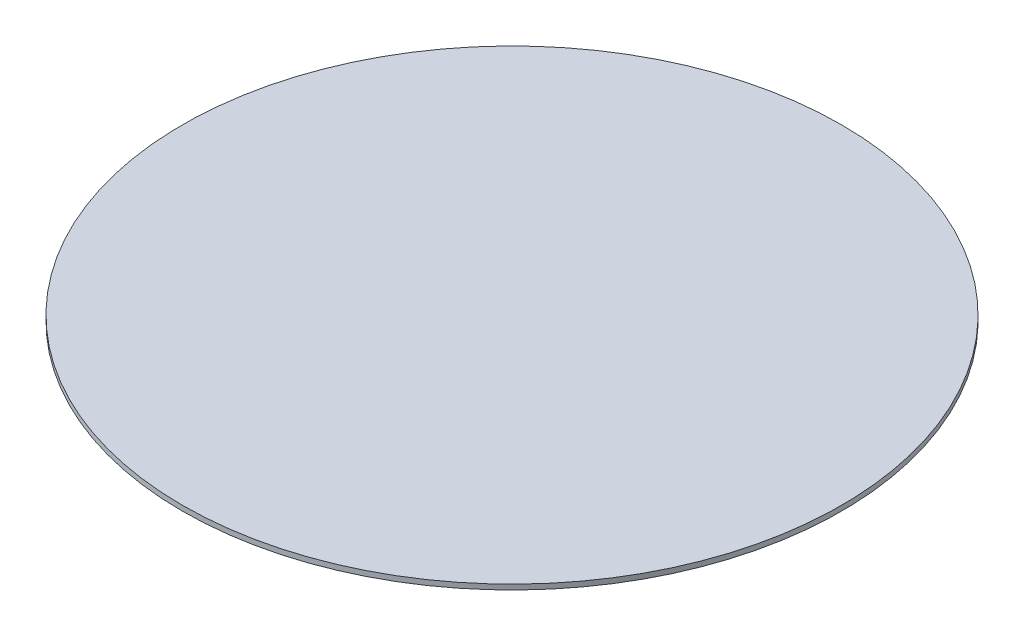
ISO-10303-21;
HEADER;
FILE_DESCRIPTION(('STEP AP214'),'2;1');
FILE_NAME('part.step','',(''),(''),'','','');
FILE_SCHEMA(('AUTOMOTIVE_DESIGN { 1 0 10303 214 1 1 1 1 }'));
ENDSEC;
DATA;
#1=APPLICATION_CONTEXT('core data for automotive mechanical design processes');
#2=APPLICATION_PROTOCOL_DEFINITION('international standard','automotive_design',2000,#1);
#3=PRODUCT_CONTEXT('',#1,'mechanical');
#4=PRODUCT('Part','Part','',(#3));
#5=PRODUCT_RELATED_PRODUCT_CATEGORY('part','',(#4));
#6=PRODUCT_DEFINITION_FORMATION('','',#4);
#7=PRODUCT_DEFINITION_CONTEXT('part definition',#1,'design');
#8=PRODUCT_DEFINITION('design','',#6,#7);
#9=PRODUCT_DEFINITION_SHAPE('','',#8);
#10=(LENGTH_UNIT() NAMED_UNIT(*) SI_UNIT(.MILLI.,.METRE.));
#11=(NAMED_UNIT(*) PLANE_ANGLE_UNIT() SI_UNIT($,.RADIAN.));
#12=(NAMED_UNIT(*) SI_UNIT($,.STERADIAN.) SOLID_ANGLE_UNIT());
#13=UNCERTAINTY_MEASURE_WITH_UNIT(LENGTH_MEASURE(1.E-05),#10,'distance_accuracy_value','');
#14=(GEOMETRIC_REPRESENTATION_CONTEXT(3) GLOBAL_UNCERTAINTY_ASSIGNED_CONTEXT((#13)) GLOBAL_UNIT_ASSIGNED_CONTEXT((#10,
#11,#12)) REPRESENTATION_CONTEXT('',''));
#15=CARTESIAN_POINT('',(0.,0.,0.));
#16=DIRECTION('',(0.,0.,1.));
#17=DIRECTION('',(1.,0.,0.));
#18=AXIS2_PLACEMENT_3D('',#15,#16,#17);
#19=CARTESIAN_POINT('',(0.,1.55,0.));
#20=DIRECTION('',(0.,-1.,0.));
#21=DIRECTION('',(0.,0.,-1.));
#22=AXIS2_PLACEMENT_3D('',#19,#20,#21);
#23=CYLINDRICAL_SURFACE('',#22,100.);
#24=CARTESIAN_POINT('',(0.,1.55,0.));
#25=DIRECTION('',(0.,1.,0.));
#26=DIRECTION('',(0.,0.,1.));
#27=AXIS2_PLACEMENT_3D('',#24,#25,#26);
#28=CIRCLE('',#27,100.);
#29=CARTESIAN_POINT('',(0.,1.55,-100.));
#30=VERTEX_POINT('',#29);
#31=EDGE_CURVE('E10',#30,#30,#28,.T.);
#32=CARTESIAN_POINT('',(0.,0.,0.));
#33=DIRECTION('',(0.,1.,0.));
#34=DIRECTION('',(0.,0.,1.));
#35=AXIS2_PLACEMENT_3D('',#32,#33,#34);
#36=CIRCLE('',#35,100.);
#37=CARTESIAN_POINT('',(0.,0.,-100.));
#38=VERTEX_POINT('',#37);
#39=EDGE_CURVE('E34',#38,#38,#36,.T.);
#40=CARTESIAN_POINT('',(0.,1.55,-100.));
#41=CARTESIAN_POINT('',(0.,1.53385416666667,-100.));
#42=CARTESIAN_POINT('',(0.,1.51770833333333,-100.));
#43=CARTESIAN_POINT('',(0.,1.48541666666667,-100.));
#44=CARTESIAN_POINT('',(0.,1.46927083333333,-100.));
#45=CARTESIAN_POINT('',(0.,1.43697916666667,-100.));
#46=CARTESIAN_POINT('',(0.,1.42083333333333,-100.));
#47=CARTESIAN_POINT('',(0.,1.38854166666667,-100.));
#48=CARTESIAN_POINT('',(0.,1.37239583333333,-100.));
#49=CARTESIAN_POINT('',(0.,1.34010416666667,-100.));
#50=CARTESIAN_POINT('',(0.,1.32395833333333,-100.));
#51=CARTESIAN_POINT('',(0.,1.29166666666667,-100.));
#52=CARTESIAN_POINT('',(0.,1.27552083333333,-100.));
#53=CARTESIAN_POINT('',(0.,1.24322916666667,-100.));
#54=CARTESIAN_POINT('',(0.,1.22708333333333,-100.));
#55=CARTESIAN_POINT('',(0.,1.19479166666667,-100.));
#56=CARTESIAN_POINT('',(0.,1.17864583333333,-100.));
#57=CARTESIAN_POINT('',(0.,1.14635416666667,-100.));
#58=CARTESIAN_POINT('',(0.,1.13020833333333,-100.));
#59=CARTESIAN_POINT('',(0.,1.09791666666667,-100.));
#60=CARTESIAN_POINT('',(0.,1.08177083333333,-100.));
#61=CARTESIAN_POINT('',(0.,1.04947916666667,-100.));
#62=CARTESIAN_POINT('',(0.,1.03333333333333,-100.));
#63=CARTESIAN_POINT('',(0.,1.00104166666667,-100.));
#64=CARTESIAN_POINT('',(0.,0.984895833333333,-100.));
#65=CARTESIAN_POINT('',(0.,0.952604166666667,-100.));
#66=CARTESIAN_POINT('',(0.,0.936458333333333,-100.));
#67=CARTESIAN_POINT('',(0.,0.904166666666667,-100.));
#68=CARTESIAN_POINT('',(0.,0.888020833333333,-100.));
#69=CARTESIAN_POINT('',(0.,0.855729166666667,-100.));
#70=CARTESIAN_POINT('',(0.,0.839583333333333,-100.));
#71=CARTESIAN_POINT('',(0.,0.807291666666667,-100.));
#72=CARTESIAN_POINT('',(0.,0.791145833333333,-100.));
#73=CARTESIAN_POINT('',(0.,0.758854166666667,-100.));
#74=CARTESIAN_POINT('',(0.,0.742708333333333,-100.));
#75=CARTESIAN_POINT('',(0.,0.710416666666667,-100.));
#76=CARTESIAN_POINT('',(0.,0.694270833333333,-100.));
#77=CARTESIAN_POINT('',(0.,0.661979166666667,-100.));
#78=CARTESIAN_POINT('',(0.,0.645833333333333,-100.));
#79=CARTESIAN_POINT('',(0.,0.613541666666667,-100.));
#80=CARTESIAN_POINT('',(0.,0.597395833333333,-100.));
#81=CARTESIAN_POINT('',(0.,0.565104166666667,-100.));
#82=CARTESIAN_POINT('',(0.,0.548958333333333,-100.));
#83=CARTESIAN_POINT('',(0.,0.516666666666667,-100.));
#84=CARTESIAN_POINT('',(0.,0.500520833333333,-100.));
#85=CARTESIAN_POINT('',(0.,0.468229166666667,-100.));
#86=CARTESIAN_POINT('',(0.,0.452083333333333,-100.));
#87=CARTESIAN_POINT('',(0.,0.419791666666667,-100.));
#88=CARTESIAN_POINT('',(0.,0.403645833333333,-100.));
#89=CARTESIAN_POINT('',(0.,0.371354166666667,-100.));
#90=CARTESIAN_POINT('',(0.,0.355208333333333,-100.));
#91=CARTESIAN_POINT('',(0.,0.322916666666667,-100.));
#92=CARTESIAN_POINT('',(0.,0.306770833333333,-100.));
#93=CARTESIAN_POINT('',(0.,0.274479166666667,-100.));
#94=CARTESIAN_POINT('',(0.,0.258333333333333,-100.));
#95=CARTESIAN_POINT('',(0.,0.226041666666667,-100.));
#96=CARTESIAN_POINT('',(0.,0.209895833333333,-100.));
#97=CARTESIAN_POINT('',(0.,0.177604166666667,-100.));
#98=CARTESIAN_POINT('',(0.,0.161458333333333,-100.));
#99=CARTESIAN_POINT('',(0.,0.129166666666667,-100.));
#100=CARTESIAN_POINT('',(0.,0.113020833333333,-100.));
#101=CARTESIAN_POINT('',(0.,0.0807291666666667,-100.));
#102=CARTESIAN_POINT('',(0.,0.0645833333333334,-100.));
#103=CARTESIAN_POINT('',(0.,0.0322916666666667,-100.));
#104=CARTESIAN_POINT('',(0.,0.0161458333333334,-100.));
#105=CARTESIAN_POINT('',(0.,0.,-100.));
#106=B_SPLINE_CURVE_WITH_KNOTS('',3,(#40,#41,#42,#43,#44,#45,#46,#47,#48,#49,#50,#51,#52,#53,
#54,#55,#56,#57,#58,#59,#60,#61,#62,#63,#64,#65,#66,#67,#68,#69,#70,#71,#72,#73,#74,#75,#76,#77,
#78,#79,#80,#81,#82,#83,#84,#85,#86,#87,#88,#89,#90,#91,#92,#93,#94,#95,#96,#97,#98,#99,#100,
#101,#102,#103,#104,#105),.UNSPECIFIED.,.F.,.F.,(4,2,2,2,2,2,2,2,2,2,2,2,2,2,2,2,2,2,2,2,2,2,2,
2,2,2,2,2,2,2,2,2,4),(0.,0.0484375000000001,0.0968750000000002,0.1453125,0.19375,0.2421875,
0.290625,0.3390625,0.3875,0.4359375,0.484375,0.5328125,0.58125,0.6296875,0.678125,0.7265625,
0.775,0.8234375,0.871875,0.9203125,0.96875,1.0171875,1.065625,1.1140625,1.1625,1.2109375,
1.259375,1.3078125,1.35625,1.4046875,1.453125,1.5015625,1.55),.UNSPECIFIED.);
#107=EDGE_CURVE('BSEAM31',#30,#38,#106,.T.);
#108=ORIENTED_EDGE('',*,*,#31,.F.);
#109=ORIENTED_EDGE('',*,*,#39,.T.);
#110=ORIENTED_EDGE('',*,*,#107,.T.);
#111=ORIENTED_EDGE('',*,*,#107,.F.);
#112=EDGE_LOOP('',(#108,#110,#109,#111));
#113=FACE_BOUND('',#112,.T.);
#114=ADVANCED_FACE('F31',(#113),#23,.T.);
#115=CARTESIAN_POINT('',(0.,1.55,0.));
#116=DIRECTION('',(0.,1.,0.));
#117=DIRECTION('',(0.,0.,1.));
#118=AXIS2_PLACEMENT_3D('',#115,#116,#117);
#119=PLANE('',#118);
#120=ORIENTED_EDGE('',*,*,#31,.T.);
#121=EDGE_LOOP('',(#120));
#122=FACE_BOUND('',#121,.T.);
#123=ADVANCED_FACE('F46',(#122),#119,.T.);
#124=CARTESIAN_POINT('',(0.,0.,0.));
#125=DIRECTION('',(0.,1.,0.));
#126=DIRECTION('',(0.,0.,1.));
#127=AXIS2_PLACEMENT_3D('',#124,#125,#126);
#128=PLANE('',#127);
#129=ORIENTED_EDGE('',*,*,#39,.F.);
#130=EDGE_LOOP('',(#129));
#131=FACE_BOUND('',#130,.T.);
#132=ADVANCED_FACE('F44',(#131),#128,.F.);
#133=CLOSED_SHELL('',(#114,#123,#132));
#134=MANIFOLD_SOLID_BREP('B2',#133);
#135=ADVANCED_BREP_SHAPE_REPRESENTATION('',(#18,#134),#14);
#136=SHAPE_DEFINITION_REPRESENTATION(#9,#135);
ENDSEC;
END-ISO-10303-21;
